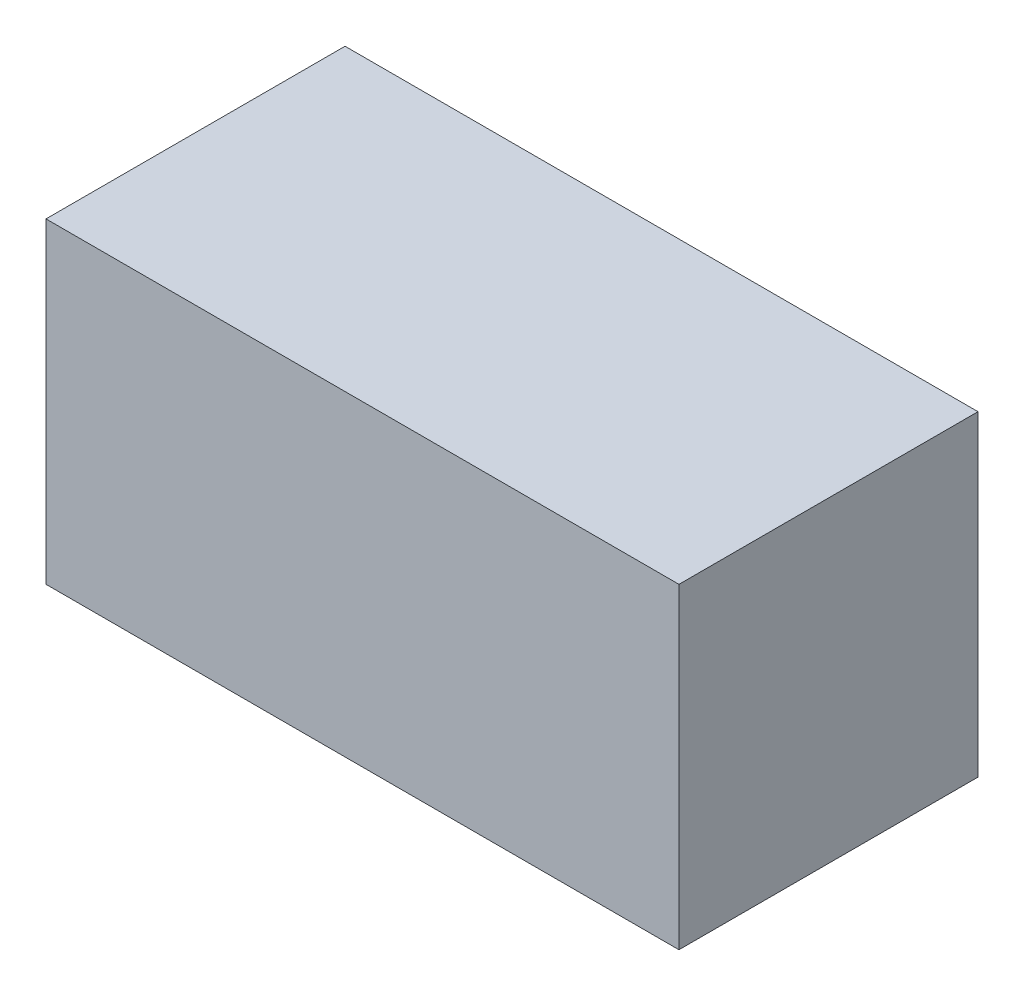
ISO-10303-21;
HEADER;
FILE_DESCRIPTION(('STEP AP214'),'2;1');
FILE_NAME('part.step','',(''),(''),'','','');
FILE_SCHEMA(('AUTOMOTIVE_DESIGN { 1 0 10303 214 1 1 1 1 }'));
ENDSEC;
DATA;
#1=APPLICATION_CONTEXT('core data for automotive mechanical design processes');
#2=APPLICATION_PROTOCOL_DEFINITION('international standard','automotive_design',2000,#1);
#3=PRODUCT_CONTEXT('',#1,'mechanical');
#4=PRODUCT('Part','Part','',(#3));
#5=PRODUCT_RELATED_PRODUCT_CATEGORY('part','',(#4));
#6=PRODUCT_DEFINITION_FORMATION('','',#4);
#7=PRODUCT_DEFINITION_CONTEXT('part definition',#1,'design');
#8=PRODUCT_DEFINITION('design','',#6,#7);
#9=PRODUCT_DEFINITION_SHAPE('','',#8);
#10=(LENGTH_UNIT() NAMED_UNIT(*) SI_UNIT(.MILLI.,.METRE.));
#11=(NAMED_UNIT(*) PLANE_ANGLE_UNIT() SI_UNIT($,.RADIAN.));
#12=(NAMED_UNIT(*) SI_UNIT($,.STERADIAN.) SOLID_ANGLE_UNIT());
#13=UNCERTAINTY_MEASURE_WITH_UNIT(LENGTH_MEASURE(1.E-05),#10,'distance_accuracy_value','');
#14=(GEOMETRIC_REPRESENTATION_CONTEXT(3) GLOBAL_UNCERTAINTY_ASSIGNED_CONTEXT((#13)) GLOBAL_UNIT_ASSIGNED_CONTEXT((#10,
#11,#12)) REPRESENTATION_CONTEXT('',''));
#15=CARTESIAN_POINT('',(0.,0.,0.));
#16=DIRECTION('',(0.,0.,1.));
#17=DIRECTION('',(1.,0.,0.));
#18=AXIS2_PLACEMENT_3D('',#15,#16,#17);
#19=CARTESIAN_POINT('',(1.27,-0.635,1.2));
#20=DIRECTION('',(0.,0.,-1.));
#21=DIRECTION('',(-1.,0.,0.));
#22=AXIS2_PLACEMENT_3D('',#19,#20,#21);
#23=PLANE('',#22);
#24=DIRECTION('',(1.,0.,0.));
#25=VECTOR('',#24,1.);
#26=CARTESIAN_POINT('',(1.27,0.635,1.2));
#27=LINE('',#26,#25);
#28=CARTESIAN_POINT('',(1.27,0.635,1.2));
#29=VERTEX_POINT('',#28);
#30=CARTESIAN_POINT('',(-1.27,0.635,1.2));
#31=VERTEX_POINT('',#30);
#32=EDGE_CURVE('E55',#29,#31,#27,.F.);
#33=ORIENTED_EDGE('',*,*,#32,.T.);
#34=DIRECTION('',(0.,1.,0.));
#35=VECTOR('',#34,1.);
#36=CARTESIAN_POINT('',(-1.27,0.635,1.2));
#37=LINE('',#36,#35);
#38=CARTESIAN_POINT('',(-1.27,-0.635,1.2));
#39=VERTEX_POINT('',#38);
#40=EDGE_CURVE('E58',#31,#39,#37,.F.);
#41=ORIENTED_EDGE('',*,*,#40,.T.);
#42=DIRECTION('',(1.,0.,0.));
#43=VECTOR('',#42,1.);
#44=CARTESIAN_POINT('',(-1.27,-0.635,1.2));
#45=LINE('',#44,#43);
#46=CARTESIAN_POINT('',(1.27,-0.635,1.2));
#47=VERTEX_POINT('',#46);
#48=EDGE_CURVE('E60',#39,#47,#45,.T.);
#49=ORIENTED_EDGE('',*,*,#48,.T.);
#50=DIRECTION('',(0.,1.,0.));
#51=VECTOR('',#50,1.);
#52=CARTESIAN_POINT('',(1.27,-0.635,1.2));
#53=LINE('',#52,#51);
#54=EDGE_CURVE('E20',#29,#47,#53,.F.);
#55=ORIENTED_EDGE('',*,*,#54,.F.);
#56=EDGE_LOOP('',(#33,#41,#49,#55));
#57=FACE_BOUND('',#56,.T.);
#58=ADVANCED_FACE('F17',(#57),#23,.F.);
#59=CARTESIAN_POINT('',(-1.27,-0.635,0.));
#60=DIRECTION('',(0.,1.,0.));
#61=DIRECTION('',(0.,0.,1.));
#62=AXIS2_PLACEMENT_3D('',#59,#60,#61);
#63=PLANE('',#62);
#64=DIRECTION('',(0.,0.,1.));
#65=VECTOR('',#64,1.);
#66=CARTESIAN_POINT('',(1.27,-0.635,0.));
#67=LINE('',#66,#65);
#68=CARTESIAN_POINT('',(1.27,-0.635,0.));
#69=VERTEX_POINT('',#68);
#70=EDGE_CURVE('E71',#69,#47,#67,.T.);
#71=ORIENTED_EDGE('',*,*,#70,.T.);
#72=ORIENTED_EDGE('',*,*,#48,.F.);
#73=DIRECTION('',(0.,0.,-1.));
#74=VECTOR('',#73,1.);
#75=CARTESIAN_POINT('',(-1.27,-0.635,0.));
#76=LINE('',#75,#74);
#77=CARTESIAN_POINT('',(-1.27,-0.635,0.));
#78=VERTEX_POINT('',#77);
#79=EDGE_CURVE('E65',#39,#78,#76,.T.);
#80=ORIENTED_EDGE('',*,*,#79,.T.);
#81=DIRECTION('',(-1.,0.,0.));
#82=VECTOR('',#81,1.);
#83=CARTESIAN_POINT('',(1.27,-0.635,0.));
#84=LINE('',#83,#82);
#85=EDGE_CURVE('E83',#69,#78,#84,.T.);
#86=ORIENTED_EDGE('',*,*,#85,.F.);
#87=EDGE_LOOP('',(#71,#72,#80,#86));
#88=FACE_BOUND('',#87,.T.);
#89=ADVANCED_FACE('F68',(#88),#63,.F.);
#90=CARTESIAN_POINT('',(-1.27,0.635,0.));
#91=DIRECTION('',(1.,0.,0.));
#92=DIRECTION('',(0.,0.,-1.));
#93=AXIS2_PLACEMENT_3D('',#90,#91,#92);
#94=PLANE('',#93);
#95=ORIENTED_EDGE('',*,*,#79,.F.);
#96=ORIENTED_EDGE('',*,*,#40,.F.);
#97=DIRECTION('',(0.,0.,-1.));
#98=VECTOR('',#97,1.);
#99=CARTESIAN_POINT('',(-1.27,0.635,0.));
#100=LINE('',#99,#98);
#101=CARTESIAN_POINT('',(-1.27,0.635,0.));
#102=VERTEX_POINT('',#101);
#103=EDGE_CURVE('E77',#31,#102,#100,.T.);
#104=ORIENTED_EDGE('',*,*,#103,.T.);
#105=DIRECTION('',(0.,1.,0.));
#106=VECTOR('',#105,1.);
#107=CARTESIAN_POINT('',(-1.27,-0.635,0.));
#108=LINE('',#107,#106);
#109=EDGE_CURVE('E74',#78,#102,#108,.T.);
#110=ORIENTED_EDGE('',*,*,#109,.F.);
#111=EDGE_LOOP('',(#95,#96,#104,#110));
#112=FACE_BOUND('',#111,.T.);
#113=ADVANCED_FACE('F72',(#112),#94,.F.);
#114=CARTESIAN_POINT('',(1.27,0.635,0.));
#115=DIRECTION('',(0.,-1.,0.));
#116=DIRECTION('',(0.,0.,-1.));
#117=AXIS2_PLACEMENT_3D('',#114,#115,#116);
#118=PLANE('',#117);
#119=ORIENTED_EDGE('',*,*,#103,.F.);
#120=ORIENTED_EDGE('',*,*,#32,.F.);
#121=DIRECTION('',(0.,0.,1.));
#122=VECTOR('',#121,1.);
#123=CARTESIAN_POINT('',(1.27,0.635,0.));
#124=LINE('',#123,#122);
#125=CARTESIAN_POINT('',(1.27,0.635,0.));
#126=VERTEX_POINT('',#125);
#127=EDGE_CURVE('E35',#29,#126,#124,.F.);
#128=ORIENTED_EDGE('',*,*,#127,.T.);
#129=DIRECTION('',(-1.,0.,0.));
#130=VECTOR('',#129,1.);
#131=CARTESIAN_POINT('',(1.27,0.635,0.));
#132=LINE('',#131,#130);
#133=EDGE_CURVE('E26',#102,#126,#132,.F.);
#134=ORIENTED_EDGE('',*,*,#133,.F.);
#135=EDGE_LOOP('',(#119,#120,#128,#134));
#136=FACE_BOUND('',#135,.T.);
#137=ADVANCED_FACE('F89',(#136),#118,.F.);
#138=CARTESIAN_POINT('',(1.27,-0.635,0.));
#139=DIRECTION('',(-1.,0.,0.));
#140=DIRECTION('',(0.,0.,1.));
#141=AXIS2_PLACEMENT_3D('',#138,#139,#140);
#142=PLANE('',#141);
#143=ORIENTED_EDGE('',*,*,#127,.F.);
#144=ORIENTED_EDGE('',*,*,#54,.T.);
#145=ORIENTED_EDGE('',*,*,#70,.F.);
#146=DIRECTION('',(0.,1.,0.));
#147=VECTOR('',#146,1.);
#148=CARTESIAN_POINT('',(1.27,-0.635,0.));
#149=LINE('',#148,#147);
#150=EDGE_CURVE('E11',#126,#69,#149,.F.);
#151=ORIENTED_EDGE('',*,*,#150,.F.);
#152=EDGE_LOOP('',(#143,#144,#145,#151));
#153=FACE_BOUND('',#152,.T.);
#154=ADVANCED_FACE('F91',(#153),#142,.F.);
#155=CARTESIAN_POINT('',(1.27,-0.635,0.));
#156=DIRECTION('',(0.,0.,-1.));
#157=DIRECTION('',(-1.,0.,0.));
#158=AXIS2_PLACEMENT_3D('',#155,#156,#157);
#159=PLANE('',#158);
#160=ORIENTED_EDGE('',*,*,#133,.T.);
#161=ORIENTED_EDGE('',*,*,#150,.T.);
#162=ORIENTED_EDGE('',*,*,#85,.T.);
#163=ORIENTED_EDGE('',*,*,#109,.T.);
#164=EDGE_LOOP('',(#160,#161,#162,#163));
#165=FACE_BOUND('',#164,.T.);
#166=ADVANCED_FACE('F88',(#165),#159,.T.);
#167=CLOSED_SHELL('',(#58,#89,#113,#137,#154,#166));
#168=MANIFOLD_SOLID_BREP('B1',#167);
#169=ADVANCED_BREP_SHAPE_REPRESENTATION('',(#18,#168),#14);
#170=SHAPE_DEFINITION_REPRESENTATION(#9,#169);
ENDSEC;
END-ISO-10303-21;
